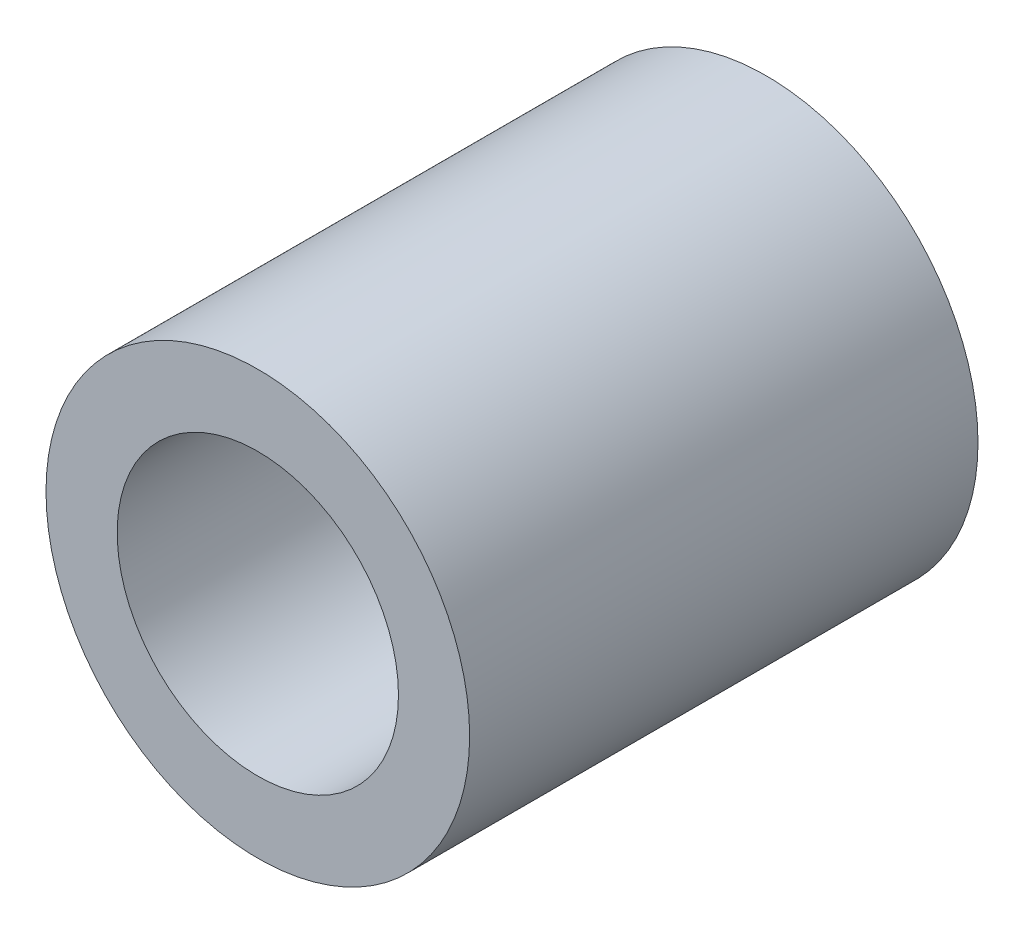
ISO-10303-21;
HEADER;
FILE_DESCRIPTION(('STEP AP214'),'2;1');
FILE_NAME('part.step','',(''),(''),'','','');
FILE_SCHEMA(('AUTOMOTIVE_DESIGN { 1 0 10303 214 1 1 1 1 }'));
ENDSEC;
DATA;
#1=APPLICATION_CONTEXT('core data for automotive mechanical design processes');
#2=APPLICATION_PROTOCOL_DEFINITION('international standard','automotive_design',2000,#1);
#3=PRODUCT_CONTEXT('',#1,'mechanical');
#4=PRODUCT('Part','Part','',(#3));
#5=PRODUCT_RELATED_PRODUCT_CATEGORY('part','',(#4));
#6=PRODUCT_DEFINITION_FORMATION('','',#4);
#7=PRODUCT_DEFINITION_CONTEXT('part definition',#1,'design');
#8=PRODUCT_DEFINITION('design','',#6,#7);
#9=PRODUCT_DEFINITION_SHAPE('','',#8);
#10=(LENGTH_UNIT() NAMED_UNIT(*) SI_UNIT(.MILLI.,.METRE.));
#11=(NAMED_UNIT(*) PLANE_ANGLE_UNIT() SI_UNIT($,.RADIAN.));
#12=(NAMED_UNIT(*) SI_UNIT($,.STERADIAN.) SOLID_ANGLE_UNIT());
#13=UNCERTAINTY_MEASURE_WITH_UNIT(LENGTH_MEASURE(1.E-05),#10,'distance_accuracy_value','');
#14=(GEOMETRIC_REPRESENTATION_CONTEXT(3) GLOBAL_UNCERTAINTY_ASSIGNED_CONTEXT((#13)) GLOBAL_UNIT_ASSIGNED_CONTEXT((#10,
#11,#12)) REPRESENTATION_CONTEXT('',''));
#15=CARTESIAN_POINT('',(0.,0.,0.));
#16=DIRECTION('',(0.,0.,1.));
#17=DIRECTION('',(1.,0.,0.));
#18=AXIS2_PLACEMENT_3D('',#15,#16,#17);
#19=CARTESIAN_POINT('',(0.,3.175,3.81));
#20=DIRECTION('',(0.,0.,-1.));
#21=DIRECTION('',(-1.,0.,0.));
#22=AXIS2_PLACEMENT_3D('',#19,#20,#21);
#23=PLANE('',#22);
#24=CARTESIAN_POINT('',(0.,0.,3.81));
#25=DIRECTION('',(0.,0.,1.));
#26=DIRECTION('',(1.,0.,0.));
#27=AXIS2_PLACEMENT_3D('',#24,#25,#26);
#28=CIRCLE('',#27,2.1082);
#29=CARTESIAN_POINT('',(2.1082,0.,3.81));
#30=VERTEX_POINT('',#29);
#31=EDGE_CURVE('E10',#30,#30,#28,.T.);
#32=ORIENTED_EDGE('',*,*,#31,.F.);
#33=EDGE_LOOP('',(#32));
#34=FACE_BOUND('',#33,.T.);
#35=CARTESIAN_POINT('',(0.,0.,3.81));
#36=DIRECTION('',(0.,0.,1.));
#37=DIRECTION('',(1.,0.,0.));
#38=AXIS2_PLACEMENT_3D('',#35,#36,#37);
#39=CIRCLE('',#38,3.175);
#40=CARTESIAN_POINT('',(3.175,0.,3.81));
#41=VERTEX_POINT('',#40);
#42=EDGE_CURVE('E55',#41,#41,#39,.T.);
#43=ORIENTED_EDGE('',*,*,#42,.T.);
#44=EDGE_LOOP('',(#43));
#45=FACE_BOUND('',#44,.T.);
#46=ADVANCED_FACE('F34',(#34,#45),#23,.F.);
#47=CARTESIAN_POINT('',(0.,0.,43.4651844186562));
#48=DIRECTION('',(0.,0.,1.));
#49=DIRECTION('',(1.,0.,0.));
#50=AXIS2_PLACEMENT_3D('',#47,#48,#49);
#51=CYLINDRICAL_SURFACE('',#50,2.1082);
#52=CARTESIAN_POINT('',(0.,0.,-3.81));
#53=DIRECTION('',(0.,0.,1.));
#54=DIRECTION('',(1.,0.,0.));
#55=AXIS2_PLACEMENT_3D('',#52,#53,#54);
#56=CIRCLE('',#55,2.1082);
#57=CARTESIAN_POINT('',(2.1082,0.,-3.81));
#58=VERTEX_POINT('',#57);
#59=EDGE_CURVE('E41',#58,#58,#56,.T.);
#60=ORIENTED_EDGE('',*,*,#59,.F.);
#61=EDGE_LOOP('',(#60));
#62=FACE_BOUND('',#61,.T.);
#63=ORIENTED_EDGE('',*,*,#31,.T.);
#64=EDGE_LOOP('',(#63));
#65=FACE_BOUND('',#64,.T.);
#66=ADVANCED_FACE('F73',(#62,#65),#51,.F.);
#67=CARTESIAN_POINT('',(0.,3.175,-3.81));
#68=DIRECTION('',(0.,0.,1.));
#69=DIRECTION('',(1.,0.,0.));
#70=AXIS2_PLACEMENT_3D('',#67,#68,#69);
#71=PLANE('',#70);
#72=CARTESIAN_POINT('',(0.,0.,-3.81));
#73=DIRECTION('',(0.,0.,1.));
#74=DIRECTION('',(1.,0.,0.));
#75=AXIS2_PLACEMENT_3D('',#72,#73,#74);
#76=CIRCLE('',#75,3.175);
#77=CARTESIAN_POINT('',(3.175,0.,-3.81));
#78=VERTEX_POINT('',#77);
#79=EDGE_CURVE('E48',#78,#78,#76,.T.);
#80=ORIENTED_EDGE('',*,*,#79,.F.);
#81=EDGE_LOOP('',(#80));
#82=FACE_BOUND('',#81,.T.);
#83=ORIENTED_EDGE('',*,*,#59,.T.);
#84=EDGE_LOOP('',(#83));
#85=FACE_BOUND('',#84,.T.);
#86=ADVANCED_FACE('F68',(#82,#85),#71,.F.);
#87=CARTESIAN_POINT('',(0.,0.,43.4651844186562));
#88=DIRECTION('',(0.,0.,1.));
#89=DIRECTION('',(1.,0.,0.));
#90=AXIS2_PLACEMENT_3D('',#87,#88,#89);
#91=CYLINDRICAL_SURFACE('',#90,3.175);
#92=ORIENTED_EDGE('',*,*,#42,.F.);
#93=EDGE_LOOP('',(#92));
#94=FACE_BOUND('',#93,.T.);
#95=ORIENTED_EDGE('',*,*,#79,.T.);
#96=EDGE_LOOP('',(#95));
#97=FACE_BOUND('',#96,.T.);
#98=ADVANCED_FACE('F65',(#94,#97),#91,.T.);
#99=CLOSED_SHELL('',(#46,#66,#86,#98));
#100=MANIFOLD_SOLID_BREP('B2',#99);
#101=ADVANCED_BREP_SHAPE_REPRESENTATION('',(#18,#100),#14);
#102=SHAPE_DEFINITION_REPRESENTATION(#9,#101);
ENDSEC;
END-ISO-10303-21;
